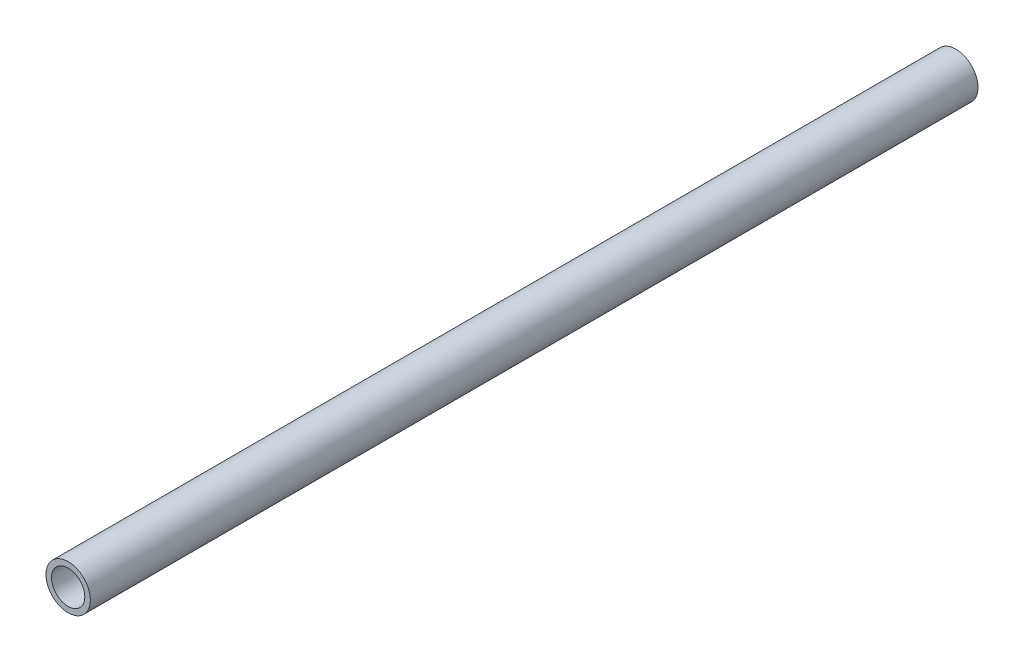
ISO-10303-21;
HEADER;
FILE_DESCRIPTION(('STEP AP214'),'2;1');
FILE_NAME('part.step','',(''),(''),'','','');
FILE_SCHEMA(('AUTOMOTIVE_DESIGN { 1 0 10303 214 1 1 1 1 }'));
ENDSEC;
DATA;
#1=APPLICATION_CONTEXT('core data for automotive mechanical design processes');
#2=APPLICATION_PROTOCOL_DEFINITION('international standard','automotive_design',2000,#1);
#3=PRODUCT_CONTEXT('',#1,'mechanical');
#4=PRODUCT('Part','Part','',(#3));
#5=PRODUCT_RELATED_PRODUCT_CATEGORY('part','',(#4));
#6=PRODUCT_DEFINITION_FORMATION('','',#4);
#7=PRODUCT_DEFINITION_CONTEXT('part definition',#1,'design');
#8=PRODUCT_DEFINITION('design','',#6,#7);
#9=PRODUCT_DEFINITION_SHAPE('','',#8);
#10=(LENGTH_UNIT() NAMED_UNIT(*) SI_UNIT(.MILLI.,.METRE.));
#11=(NAMED_UNIT(*) PLANE_ANGLE_UNIT() SI_UNIT($,.RADIAN.));
#12=(NAMED_UNIT(*) SI_UNIT($,.STERADIAN.) SOLID_ANGLE_UNIT());
#13=UNCERTAINTY_MEASURE_WITH_UNIT(LENGTH_MEASURE(1.E-05),#10,'distance_accuracy_value','');
#14=(GEOMETRIC_REPRESENTATION_CONTEXT(3) GLOBAL_UNCERTAINTY_ASSIGNED_CONTEXT((#13)) GLOBAL_UNIT_ASSIGNED_CONTEXT((#10,
#11,#12)) REPRESENTATION_CONTEXT('',''));
#15=CARTESIAN_POINT('',(0.,0.,0.));
#16=DIRECTION('',(0.,0.,1.));
#17=DIRECTION('',(1.,0.,0.));
#18=AXIS2_PLACEMENT_3D('',#15,#16,#17);
#19=CARTESIAN_POINT('',(0.,0.,127.));
#20=DIRECTION('',(0.,0.,1.));
#21=DIRECTION('',(1.,0.,0.));
#22=AXIS2_PLACEMENT_3D('',#19,#20,#21);
#23=PLANE('',#22);
#24=CARTESIAN_POINT('',(0.,0.,127.));
#25=DIRECTION('',(0.,0.,1.));
#26=DIRECTION('',(1.,0.,0.));
#27=AXIS2_PLACEMENT_3D('',#24,#25,#26);
#28=CIRCLE('',#27,6.35);
#29=CARTESIAN_POINT('',(6.35,0.,127.));
#30=VERTEX_POINT('',#29);
#31=EDGE_CURVE('E10',#30,#30,#28,.T.);
#32=ORIENTED_EDGE('',*,*,#31,.T.);
#33=EDGE_LOOP('',(#32));
#34=FACE_BOUND('',#33,.T.);
#35=CARTESIAN_POINT('',(0.,0.,127.));
#36=DIRECTION('',(0.,0.,1.));
#37=DIRECTION('',(1.,0.,0.));
#38=AXIS2_PLACEMENT_3D('',#35,#36,#37);
#39=CIRCLE('',#38,4.7625);
#40=CARTESIAN_POINT('',(4.7625,0.,127.));
#41=VERTEX_POINT('',#40);
#42=EDGE_CURVE('E50',#41,#41,#39,.T.);
#43=ORIENTED_EDGE('',*,*,#42,.F.);
#44=EDGE_LOOP('',(#43));
#45=FACE_BOUND('',#44,.T.);
#46=ADVANCED_FACE('F37',(#34,#45),#23,.T.);
#47=CARTESIAN_POINT('',(0.,0.,-127.));
#48=DIRECTION('',(0.,0.,1.));
#49=DIRECTION('',(1.,0.,0.));
#50=AXIS2_PLACEMENT_3D('',#47,#48,#49);
#51=PLANE('',#50);
#52=CARTESIAN_POINT('',(0.,0.,-127.));
#53=DIRECTION('',(0.,0.,1.));
#54=DIRECTION('',(1.,0.,0.));
#55=AXIS2_PLACEMENT_3D('',#52,#53,#54);
#56=CIRCLE('',#55,6.35);
#57=CARTESIAN_POINT('',(6.35,0.,-127.));
#58=VERTEX_POINT('',#57);
#59=EDGE_CURVE('E41',#58,#58,#56,.T.);
#60=ORIENTED_EDGE('',*,*,#59,.F.);
#61=EDGE_LOOP('',(#60));
#62=FACE_BOUND('',#61,.T.);
#63=CARTESIAN_POINT('',(0.,0.,-127.));
#64=DIRECTION('',(0.,0.,1.));
#65=DIRECTION('',(1.,0.,0.));
#66=AXIS2_PLACEMENT_3D('',#63,#64,#65);
#67=CIRCLE('',#66,4.7625);
#68=CARTESIAN_POINT('',(4.7625,0.,-127.));
#69=VERTEX_POINT('',#68);
#70=EDGE_CURVE('E52',#69,#69,#67,.T.);
#71=ORIENTED_EDGE('',*,*,#70,.T.);
#72=EDGE_LOOP('',(#71));
#73=FACE_BOUND('',#72,.T.);
#74=ADVANCED_FACE('F64',(#62,#73),#51,.F.);
#75=CARTESIAN_POINT('',(0.,0.,127.));
#76=DIRECTION('',(0.,0.,-1.));
#77=DIRECTION('',(-1.,0.,0.));
#78=AXIS2_PLACEMENT_3D('',#75,#76,#77);
#79=CYLINDRICAL_SURFACE('',#78,6.35);
#80=ORIENTED_EDGE('',*,*,#31,.F.);
#81=EDGE_LOOP('',(#80));
#82=FACE_BOUND('',#81,.T.);
#83=ORIENTED_EDGE('',*,*,#59,.T.);
#84=EDGE_LOOP('',(#83));
#85=FACE_BOUND('',#84,.T.);
#86=ADVANCED_FACE('F39',(#82,#85),#79,.T.);
#87=CARTESIAN_POINT('',(0.,0.,127.));
#88=DIRECTION('',(0.,0.,-1.));
#89=DIRECTION('',(-1.,0.,0.));
#90=AXIS2_PLACEMENT_3D('',#87,#88,#89);
#91=CYLINDRICAL_SURFACE('',#90,4.7625);
#92=ORIENTED_EDGE('',*,*,#42,.T.);
#93=EDGE_LOOP('',(#92));
#94=FACE_BOUND('',#93,.T.);
#95=ORIENTED_EDGE('',*,*,#70,.F.);
#96=EDGE_LOOP('',(#95));
#97=FACE_BOUND('',#96,.T.);
#98=ADVANCED_FACE('F60',(#94,#97),#91,.F.);
#99=CLOSED_SHELL('',(#46,#74,#86,#98));
#100=MANIFOLD_SOLID_BREP('B2',#99);
#101=ADVANCED_BREP_SHAPE_REPRESENTATION('',(#18,#100),#14);
#102=SHAPE_DEFINITION_REPRESENTATION(#9,#101);
ENDSEC;
END-ISO-10303-21;
